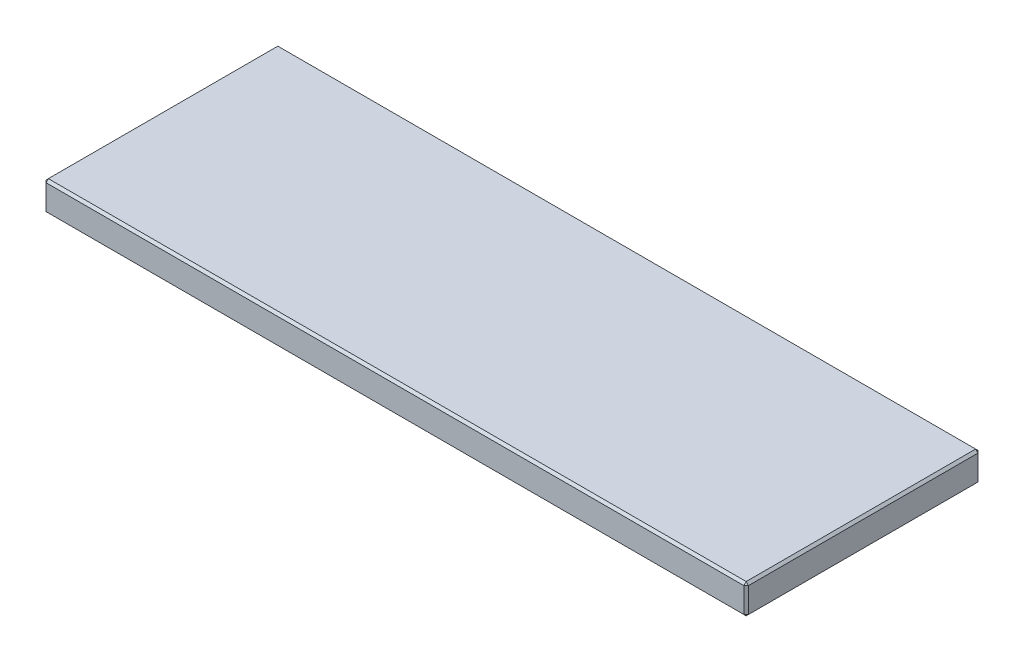
ISO-10303-21;
HEADER;
FILE_DESCRIPTION(('STEP AP214'),'2;1');
FILE_NAME('part.step','',(''),(''),'','','');
FILE_SCHEMA(('AUTOMOTIVE_DESIGN { 1 0 10303 214 1 1 1 1 }'));
ENDSEC;
DATA;
#1=APPLICATION_CONTEXT('core data for automotive mechanical design processes');
#2=APPLICATION_PROTOCOL_DEFINITION('international standard','automotive_design',2000,#1);
#3=PRODUCT_CONTEXT('',#1,'mechanical');
#4=PRODUCT('Part','Part','',(#3));
#5=PRODUCT_RELATED_PRODUCT_CATEGORY('part','',(#4));
#6=PRODUCT_DEFINITION_FORMATION('','',#4);
#7=PRODUCT_DEFINITION_CONTEXT('part definition',#1,'design');
#8=PRODUCT_DEFINITION('design','',#6,#7);
#9=PRODUCT_DEFINITION_SHAPE('','',#8);
#10=(LENGTH_UNIT() NAMED_UNIT(*) SI_UNIT(.MILLI.,.METRE.));
#11=(NAMED_UNIT(*) PLANE_ANGLE_UNIT() SI_UNIT($,.RADIAN.));
#12=(NAMED_UNIT(*) SI_UNIT($,.STERADIAN.) SOLID_ANGLE_UNIT());
#13=UNCERTAINTY_MEASURE_WITH_UNIT(LENGTH_MEASURE(1.E-05),#10,'distance_accuracy_value','');
#14=(GEOMETRIC_REPRESENTATION_CONTEXT(3) GLOBAL_UNCERTAINTY_ASSIGNED_CONTEXT((#13)) GLOBAL_UNIT_ASSIGNED_CONTEXT((#10,
#11,#12)) REPRESENTATION_CONTEXT('',''));
#15=CARTESIAN_POINT('',(0.,0.,0.));
#16=DIRECTION('',(0.,0.,1.));
#17=DIRECTION('',(1.,0.,0.));
#18=AXIS2_PLACEMENT_3D('',#15,#16,#17);
#19=CARTESIAN_POINT('',(37.5,3.175,12.5));
#20=DIRECTION('',(-1.,0.,0.));
#21=DIRECTION('',(0.,0.,1.));
#22=AXIS2_PLACEMENT_3D('',#19,#20,#21);
#23=PLANE('',#22);
#24=DIRECTION('',(0.,-1.,0.));
#25=VECTOR('',#24,1.);
#26=CARTESIAN_POINT('',(37.5,3.175,12.25));
#27=LINE('',#26,#25);
#28=CARTESIAN_POINT('',(37.5,2.925,12.25));
#29=VERTEX_POINT('',#28);
#30=CARTESIAN_POINT('',(37.5,0.25,12.25));
#31=VERTEX_POINT('',#30);
#32=EDGE_CURVE('E131',#29,#31,#27,.T.);
#33=ORIENTED_EDGE('',*,*,#32,.T.);
#34=DIRECTION('',(0.,0.,-1.));
#35=VECTOR('',#34,1.);
#36=CARTESIAN_POINT('',(37.5,0.25,-12.5));
#37=LINE('',#36,#35);
#38=CARTESIAN_POINT('',(37.5,0.25,-12.25));
#39=VERTEX_POINT('',#38);
#40=EDGE_CURVE('E167',#31,#39,#37,.T.);
#41=ORIENTED_EDGE('',*,*,#40,.T.);
#42=DIRECTION('',(0.,1.,0.));
#43=VECTOR('',#42,1.);
#44=CARTESIAN_POINT('',(37.5,3.175,-12.25));
#45=LINE('',#44,#43);
#46=CARTESIAN_POINT('',(37.5,2.925,-12.25));
#47=VERTEX_POINT('',#46);
#48=EDGE_CURVE('E134',#39,#47,#45,.T.);
#49=ORIENTED_EDGE('',*,*,#48,.T.);
#50=DIRECTION('',(0.,0.,1.));
#51=VECTOR('',#50,1.);
#52=CARTESIAN_POINT('',(37.5,2.925,12.5));
#53=LINE('',#52,#51);
#54=EDGE_CURVE('E127',#47,#29,#53,.T.);
#55=ORIENTED_EDGE('',*,*,#54,.T.);
#56=EDGE_LOOP('',(#33,#41,#49,#55));
#57=FACE_BOUND('',#56,.T.);
#58=ADVANCED_FACE('F39',(#57),#23,.F.);
#59=CARTESIAN_POINT('',(-37.5,3.175,-12.5));
#60=DIRECTION('',(0.,0.,1.));
#61=DIRECTION('',(1.,0.,0.));
#62=AXIS2_PLACEMENT_3D('',#59,#60,#61);
#63=PLANE('',#62);
#64=DIRECTION('',(1.,0.,0.));
#65=VECTOR('',#64,1.);
#66=CARTESIAN_POINT('',(-37.5,2.925,-12.5));
#67=LINE('',#66,#65);
#68=CARTESIAN_POINT('',(-37.25,2.925,-12.5));
#69=VERTEX_POINT('',#68);
#70=CARTESIAN_POINT('',(37.25,2.925,-12.5));
#71=VERTEX_POINT('',#70);
#72=EDGE_CURVE('E178',#69,#71,#67,.T.);
#73=ORIENTED_EDGE('',*,*,#72,.T.);
#74=DIRECTION('',(0.,-1.,0.));
#75=VECTOR('',#74,1.);
#76=CARTESIAN_POINT('',(37.25,3.175,-12.5));
#77=LINE('',#76,#75);
#78=CARTESIAN_POINT('',(37.25,0.25,-12.5));
#79=VERTEX_POINT('',#78);
#80=EDGE_CURVE('E184',#71,#79,#77,.T.);
#81=ORIENTED_EDGE('',*,*,#80,.T.);
#82=DIRECTION('',(-1.,0.,0.));
#83=VECTOR('',#82,1.);
#84=CARTESIAN_POINT('',(-37.5,0.25,-12.5));
#85=LINE('',#84,#83);
#86=CARTESIAN_POINT('',(-37.25,0.25,-12.5));
#87=VERTEX_POINT('',#86);
#88=EDGE_CURVE('E182',#79,#87,#85,.T.);
#89=ORIENTED_EDGE('',*,*,#88,.T.);
#90=DIRECTION('',(0.,1.,0.));
#91=VECTOR('',#90,1.);
#92=CARTESIAN_POINT('',(-37.25,3.175,-12.5));
#93=LINE('',#92,#91);
#94=EDGE_CURVE('E180',#87,#69,#93,.T.);
#95=ORIENTED_EDGE('',*,*,#94,.T.);
#96=EDGE_LOOP('',(#73,#81,#89,#95));
#97=FACE_BOUND('',#96,.T.);
#98=ADVANCED_FACE('F271',(#97),#63,.F.);
#99=CARTESIAN_POINT('',(-37.5,3.175,12.5));
#100=DIRECTION('',(1.,0.,0.));
#101=DIRECTION('',(0.,0.,-1.));
#102=AXIS2_PLACEMENT_3D('',#99,#100,#101);
#103=PLANE('',#102);
#104=DIRECTION('',(0.,0.,-1.));
#105=VECTOR('',#104,1.);
#106=CARTESIAN_POINT('',(-37.5,2.925,12.5));
#107=LINE('',#106,#105);
#108=CARTESIAN_POINT('',(-37.5,2.925,12.25));
#109=VERTEX_POINT('',#108);
#110=CARTESIAN_POINT('',(-37.5,2.925,-12.25));
#111=VERTEX_POINT('',#110);
#112=EDGE_CURVE('E189',#109,#111,#107,.T.);
#113=ORIENTED_EDGE('',*,*,#112,.T.);
#114=DIRECTION('',(0.,-1.,0.));
#115=VECTOR('',#114,1.);
#116=CARTESIAN_POINT('',(-37.5,3.175,-12.25));
#117=LINE('',#116,#115);
#118=CARTESIAN_POINT('',(-37.5,0.25,-12.25));
#119=VERTEX_POINT('',#118);
#120=EDGE_CURVE('E193',#111,#119,#117,.T.);
#121=ORIENTED_EDGE('',*,*,#120,.T.);
#122=DIRECTION('',(0.,0.,1.));
#123=VECTOR('',#122,1.);
#124=CARTESIAN_POINT('',(-37.5,0.25,12.5));
#125=LINE('',#124,#123);
#126=CARTESIAN_POINT('',(-37.5,0.25,12.25));
#127=VERTEX_POINT('',#126);
#128=EDGE_CURVE('E191',#119,#127,#125,.T.);
#129=ORIENTED_EDGE('',*,*,#128,.T.);
#130=DIRECTION('',(0.,1.,0.));
#131=VECTOR('',#130,1.);
#132=CARTESIAN_POINT('',(-37.5,3.175,12.25));
#133=LINE('',#132,#131);
#134=EDGE_CURVE('E187',#127,#109,#133,.T.);
#135=ORIENTED_EDGE('',*,*,#134,.T.);
#136=EDGE_LOOP('',(#113,#121,#129,#135));
#137=FACE_BOUND('',#136,.T.);
#138=ADVANCED_FACE('F280',(#137),#103,.F.);
#139=CARTESIAN_POINT('',(-37.5,3.175,12.5));
#140=DIRECTION('',(0.,0.,-1.));
#141=DIRECTION('',(-1.,0.,0.));
#142=AXIS2_PLACEMENT_3D('',#139,#140,#141);
#143=PLANE('',#142);
#144=DIRECTION('',(-1.,0.,0.));
#145=VECTOR('',#144,1.);
#146=CARTESIAN_POINT('',(-37.5,2.925,12.5));
#147=LINE('',#146,#145);
#148=CARTESIAN_POINT('',(37.25,2.925,12.5));
#149=VERTEX_POINT('',#148);
#150=CARTESIAN_POINT('',(-37.25,2.925,12.5));
#151=VERTEX_POINT('',#150);
#152=EDGE_CURVE('E49',#149,#151,#147,.T.);
#153=ORIENTED_EDGE('',*,*,#152,.T.);
#154=DIRECTION('',(0.,-1.,0.));
#155=VECTOR('',#154,1.);
#156=CARTESIAN_POINT('',(-37.25,3.175,12.5));
#157=LINE('',#156,#155);
#158=CARTESIAN_POINT('',(-37.25,0.25,12.5));
#159=VERTEX_POINT('',#158);
#160=EDGE_CURVE('E11',#151,#159,#157,.T.);
#161=ORIENTED_EDGE('',*,*,#160,.T.);
#162=DIRECTION('',(1.,0.,0.));
#163=VECTOR('',#162,1.);
#164=CARTESIAN_POINT('',(37.5,0.25,12.5));
#165=LINE('',#164,#163);
#166=CARTESIAN_POINT('',(37.25,0.25,12.5));
#167=VERTEX_POINT('',#166);
#168=EDGE_CURVE('E204',#159,#167,#165,.T.);
#169=ORIENTED_EDGE('',*,*,#168,.T.);
#170=DIRECTION('',(0.,1.,0.));
#171=VECTOR('',#170,1.);
#172=CARTESIAN_POINT('',(37.25,3.175,12.5));
#173=LINE('',#172,#171);
#174=EDGE_CURVE('E60',#167,#149,#173,.T.);
#175=ORIENTED_EDGE('',*,*,#174,.T.);
#176=EDGE_LOOP('',(#153,#161,#169,#175));
#177=FACE_BOUND('',#176,.T.);
#178=ADVANCED_FACE('F292',(#177),#143,.F.);
#179=CARTESIAN_POINT('',(0.,3.175,0.));
#180=DIRECTION('',(0.,-1.,0.));
#181=DIRECTION('',(0.,0.,-1.));
#182=AXIS2_PLACEMENT_3D('',#179,#180,#181);
#183=PLANE('',#182);
#184=DIRECTION('',(-1.,0.,0.));
#185=VECTOR('',#184,1.);
#186=CARTESIAN_POINT('',(0.,3.175,-12.25));
#187=LINE('',#186,#185);
#188=CARTESIAN_POINT('',(37.25,3.175,-12.25));
#189=VERTEX_POINT('',#188);
#190=CARTESIAN_POINT('',(-37.25,3.175,-12.25));
#191=VERTEX_POINT('',#190);
#192=EDGE_CURVE('E199',#189,#191,#187,.T.);
#193=ORIENTED_EDGE('',*,*,#192,.T.);
#194=DIRECTION('',(0.,0.,1.));
#195=VECTOR('',#194,1.);
#196=CARTESIAN_POINT('',(-37.25,3.175,0.));
#197=LINE('',#196,#195);
#198=CARTESIAN_POINT('',(-37.25,3.175,12.25));
#199=VERTEX_POINT('',#198);
#200=EDGE_CURVE('E201',#191,#199,#197,.T.);
#201=ORIENTED_EDGE('',*,*,#200,.T.);
#202=DIRECTION('',(1.,0.,0.));
#203=VECTOR('',#202,1.);
#204=CARTESIAN_POINT('',(0.,3.175,12.25));
#205=LINE('',#204,#203);
#206=CARTESIAN_POINT('',(37.25,3.175,12.25));
#207=VERTEX_POINT('',#206);
#208=EDGE_CURVE('E196',#199,#207,#205,.T.);
#209=ORIENTED_EDGE('',*,*,#208,.T.);
#210=DIRECTION('',(0.,0.,-1.));
#211=VECTOR('',#210,1.);
#212=CARTESIAN_POINT('',(37.25,3.175,0.));
#213=LINE('',#212,#211);
#214=EDGE_CURVE('E144',#207,#189,#213,.T.);
#215=ORIENTED_EDGE('',*,*,#214,.T.);
#216=EDGE_LOOP('',(#193,#201,#209,#215));
#217=FACE_BOUND('',#216,.T.);
#218=ADVANCED_FACE('F425',(#217),#183,.F.);
#219=CARTESIAN_POINT('',(0.,0.,0.));
#220=DIRECTION('',(0.,-1.,0.));
#221=DIRECTION('',(0.,0.,-1.));
#222=AXIS2_PLACEMENT_3D('',#219,#220,#221);
#223=PLANE('',#222);
#224=DIRECTION('',(1.,0.,0.));
#225=VECTOR('',#224,1.);
#226=CARTESIAN_POINT('',(37.5,0.,-12.25));
#227=LINE('',#226,#225);
#228=CARTESIAN_POINT('',(-37.25,0.,-12.25));
#229=VERTEX_POINT('',#228);
#230=CARTESIAN_POINT('',(37.25,0.,-12.25));
#231=VERTEX_POINT('',#230);
#232=EDGE_CURVE('E173',#229,#231,#227,.T.);
#233=ORIENTED_EDGE('',*,*,#232,.T.);
#234=DIRECTION('',(0.,0.,1.));
#235=VECTOR('',#234,1.);
#236=CARTESIAN_POINT('',(37.25,0.,12.5));
#237=LINE('',#236,#235);
#238=CARTESIAN_POINT('',(37.25,0.,12.25));
#239=VERTEX_POINT('',#238);
#240=EDGE_CURVE('E175',#231,#239,#237,.T.);
#241=ORIENTED_EDGE('',*,*,#240,.T.);
#242=DIRECTION('',(-1.,0.,0.));
#243=VECTOR('',#242,1.);
#244=CARTESIAN_POINT('',(-37.5,0.,12.25));
#245=LINE('',#244,#243);
#246=CARTESIAN_POINT('',(-37.25,0.,12.25));
#247=VERTEX_POINT('',#246);
#248=EDGE_CURVE('E169',#239,#247,#245,.T.);
#249=ORIENTED_EDGE('',*,*,#248,.T.);
#250=DIRECTION('',(0.,0.,-1.));
#251=VECTOR('',#250,1.);
#252=CARTESIAN_POINT('',(-37.25,0.,-12.5));
#253=LINE('',#252,#251);
#254=EDGE_CURVE('E171',#247,#229,#253,.T.);
#255=ORIENTED_EDGE('',*,*,#254,.T.);
#256=EDGE_LOOP('',(#233,#241,#249,#255));
#257=FACE_BOUND('',#256,.T.);
#258=ADVANCED_FACE('F421',(#257),#223,.T.);
#259=CARTESIAN_POINT('',(-37.25,3.175,0.));
#260=DIRECTION('',(0.707106781186547,-0.707106781186547,0.));
#261=DIRECTION('',(0.,0.,1.));
#262=AXIS2_PLACEMENT_3D('',#259,#260,#261);
#263=PLANE('',#262);
#264=DIRECTION('',(0.707106781186547,0.707106781186547,0.));
#265=VECTOR('',#264,1.);
#266=CARTESIAN_POINT('',(-37.25,3.175,12.25));
#267=LINE('',#266,#265);
#268=EDGE_CURVE('E44',#199,#109,#267,.F.);
#269=ORIENTED_EDGE('',*,*,#268,.F.);
#270=ORIENTED_EDGE('',*,*,#200,.F.);
#271=DIRECTION('',(-0.707106781186547,-0.707106781186547,0.));
#272=VECTOR('',#271,1.);
#273=CARTESIAN_POINT('',(-37.375,3.05,-12.25));
#274=LINE('',#273,#272);
#275=EDGE_CURVE('E164',#111,#191,#274,.F.);
#276=ORIENTED_EDGE('',*,*,#275,.F.);
#277=ORIENTED_EDGE('',*,*,#112,.F.);
#278=EDGE_LOOP('',(#269,#270,#276,#277));
#279=FACE_BOUND('',#278,.T.);
#280=ADVANCED_FACE('F42',(#279),#263,.F.);
#281=CARTESIAN_POINT('',(-37.25,3.175,12.25));
#282=DIRECTION('',(-0.577350269189626,0.577350269189626,0.577350269189626));
#283=DIRECTION('',(0.707106781186547,0.,0.707106781186547));
#284=AXIS2_PLACEMENT_3D('',#281,#282,#283);
#285=PLANE('',#284);
#286=DIRECTION('',(0.,-0.707106781186547,0.707106781186547));
#287=VECTOR('',#286,1.);
#288=CARTESIAN_POINT('',(-37.25,3.175,12.25));
#289=LINE('',#288,#287);
#290=EDGE_CURVE('E250',#199,#151,#289,.T.);
#291=ORIENTED_EDGE('',*,*,#290,.F.);
#292=ORIENTED_EDGE('',*,*,#268,.T.);
#293=DIRECTION('',(-0.707106781186547,0.,-0.707106781186547));
#294=VECTOR('',#293,1.);
#295=CARTESIAN_POINT('',(-37.375,2.925,12.375));
#296=LINE('',#295,#294);
#297=EDGE_CURVE('E252',#151,#109,#296,.T.);
#298=ORIENTED_EDGE('',*,*,#297,.F.);
#299=EDGE_LOOP('',(#291,#292,#298));
#300=FACE_BOUND('',#299,.T.);
#301=ADVANCED_FACE('F286',(#300),#285,.T.);
#302=CARTESIAN_POINT('',(-37.25,2.925,-12.5));
#303=DIRECTION('',(-0.577350269189626,0.577350269189626,-0.577350269189626));
#304=DIRECTION('',(-0.707106781186547,0.,0.707106781186547));
#305=AXIS2_PLACEMENT_3D('',#302,#303,#304);
#306=PLANE('',#305);
#307=DIRECTION('',(0.707106781186547,0.,-0.707106781186547));
#308=VECTOR('',#307,1.);
#309=CARTESIAN_POINT('',(-37.25,2.925,-12.5));
#310=LINE('',#309,#308);
#311=EDGE_CURVE('E244',#111,#69,#310,.T.);
#312=ORIENTED_EDGE('',*,*,#311,.F.);
#313=ORIENTED_EDGE('',*,*,#275,.T.);
#314=DIRECTION('',(0.,0.707106781186547,0.707106781186547));
#315=VECTOR('',#314,1.);
#316=CARTESIAN_POINT('',(-37.25,2.925,-12.5));
#317=LINE('',#316,#315);
#318=EDGE_CURVE('E247',#69,#191,#317,.T.);
#319=ORIENTED_EDGE('',*,*,#318,.F.);
#320=EDGE_LOOP('',(#312,#313,#319));
#321=FACE_BOUND('',#320,.T.);
#322=ADVANCED_FACE('F259',(#321),#306,.T.);
#323=CARTESIAN_POINT('',(-37.25,3.175,12.5));
#324=DIRECTION('',(0.707106781186547,0.,-0.707106781186547));
#325=DIRECTION('',(0.,-1.,0.));
#326=AXIS2_PLACEMENT_3D('',#323,#324,#325);
#327=PLANE('',#326);
#328=ORIENTED_EDGE('',*,*,#297,.T.);
#329=ORIENTED_EDGE('',*,*,#134,.F.);
#330=DIRECTION('',(0.707106781186547,0.,0.707106781186547));
#331=VECTOR('',#330,1.);
#332=CARTESIAN_POINT('',(-37.5,0.25,12.25));
#333=LINE('',#332,#331);
#334=EDGE_CURVE('E238',#159,#127,#333,.F.);
#335=ORIENTED_EDGE('',*,*,#334,.F.);
#336=ORIENTED_EDGE('',*,*,#160,.F.);
#337=EDGE_LOOP('',(#328,#329,#335,#336));
#338=FACE_BOUND('',#337,.T.);
#339=ADVANCED_FACE('F289',(#338),#327,.F.);
#340=CARTESIAN_POINT('',(0.,3.175,12.25));
#341=DIRECTION('',(0.,-0.707106781186547,-0.707106781186547));
#342=DIRECTION('',(1.,0.,0.));
#343=AXIS2_PLACEMENT_3D('',#340,#341,#342);
#344=PLANE('',#343);
#345=ORIENTED_EDGE('',*,*,#290,.T.);
#346=ORIENTED_EDGE('',*,*,#152,.F.);
#347=DIRECTION('',(0.,0.707106781186547,-0.707106781186547));
#348=VECTOR('',#347,1.);
#349=CARTESIAN_POINT('',(37.25,3.05,12.375));
#350=LINE('',#349,#348);
#351=EDGE_CURVE('E148',#207,#149,#350,.F.);
#352=ORIENTED_EDGE('',*,*,#351,.F.);
#353=ORIENTED_EDGE('',*,*,#208,.F.);
#354=EDGE_LOOP('',(#345,#346,#352,#353));
#355=FACE_BOUND('',#354,.T.);
#356=ADVANCED_FACE('F403',(#355),#344,.F.);
#357=CARTESIAN_POINT('',(37.25,3.175,0.));
#358=DIRECTION('',(-0.707106781186547,-0.707106781186547,0.));
#359=DIRECTION('',(0.,0.,-1.));
#360=AXIS2_PLACEMENT_3D('',#357,#358,#359);
#361=PLANE('',#360);
#362=DIRECTION('',(-0.707106781186547,0.707106781186547,0.));
#363=VECTOR('',#362,1.);
#364=CARTESIAN_POINT('',(37.5,2.925,-12.25));
#365=LINE('',#364,#363);
#366=EDGE_CURVE('E149',#189,#47,#365,.F.);
#367=ORIENTED_EDGE('',*,*,#366,.F.);
#368=ORIENTED_EDGE('',*,*,#214,.F.);
#369=DIRECTION('',(0.707106781186547,-0.707106781186547,0.));
#370=VECTOR('',#369,1.);
#371=CARTESIAN_POINT('',(37.5,2.925,12.25));
#372=LINE('',#371,#370);
#373=EDGE_CURVE('E141',#29,#207,#372,.F.);
#374=ORIENTED_EDGE('',*,*,#373,.F.);
#375=ORIENTED_EDGE('',*,*,#54,.F.);
#376=EDGE_LOOP('',(#367,#368,#374,#375));
#377=FACE_BOUND('',#376,.T.);
#378=ADVANCED_FACE('F143',(#377),#361,.F.);
#379=CARTESIAN_POINT('',(0.,3.175,-12.25));
#380=DIRECTION('',(0.,-0.707106781186547,0.707106781186547));
#381=DIRECTION('',(-1.,0.,0.));
#382=AXIS2_PLACEMENT_3D('',#379,#380,#381);
#383=PLANE('',#382);
#384=ORIENTED_EDGE('',*,*,#318,.T.);
#385=ORIENTED_EDGE('',*,*,#192,.F.);
#386=DIRECTION('',(0.,-0.707106781186547,-0.707106781186547));
#387=VECTOR('',#386,1.);
#388=CARTESIAN_POINT('',(37.25,3.05,-12.375));
#389=LINE('',#388,#387);
#390=EDGE_CURVE('E233',#71,#189,#389,.F.);
#391=ORIENTED_EDGE('',*,*,#390,.F.);
#392=ORIENTED_EDGE('',*,*,#72,.F.);
#393=EDGE_LOOP('',(#384,#385,#391,#392));
#394=FACE_BOUND('',#393,.T.);
#395=ADVANCED_FACE('F267',(#394),#383,.F.);
#396=CARTESIAN_POINT('',(-37.5,3.175,-12.25));
#397=DIRECTION('',(0.707106781186547,0.,0.707106781186547));
#398=DIRECTION('',(0.,-1.,0.));
#399=AXIS2_PLACEMENT_3D('',#396,#397,#398);
#400=PLANE('',#399);
#401=ORIENTED_EDGE('',*,*,#311,.T.);
#402=ORIENTED_EDGE('',*,*,#94,.F.);
#403=DIRECTION('',(-0.707106781186547,0.,0.707106781186547));
#404=VECTOR('',#403,1.);
#405=CARTESIAN_POINT('',(-37.25,0.25,-12.5));
#406=LINE('',#405,#404);
#407=EDGE_CURVE('E230',#119,#87,#406,.F.);
#408=ORIENTED_EDGE('',*,*,#407,.F.);
#409=ORIENTED_EDGE('',*,*,#120,.F.);
#410=EDGE_LOOP('',(#401,#402,#408,#409));
#411=FACE_BOUND('',#410,.T.);
#412=ADVANCED_FACE('F277',(#411),#400,.F.);
#413=CARTESIAN_POINT('',(-37.5,0.25,12.5));
#414=DIRECTION('',(-0.707106781186547,-0.707106781186547,0.));
#415=DIRECTION('',(0.,0.,-1.));
#416=AXIS2_PLACEMENT_3D('',#413,#414,#415);
#417=PLANE('',#416);
#418=DIRECTION('',(0.707106781186547,-0.707106781186547,0.));
#419=VECTOR('',#418,1.);
#420=CARTESIAN_POINT('',(-37.5,0.25,12.25));
#421=LINE('',#420,#419);
#422=EDGE_CURVE('E241',#127,#247,#421,.T.);
#423=ORIENTED_EDGE('',*,*,#422,.F.);
#424=ORIENTED_EDGE('',*,*,#128,.F.);
#425=DIRECTION('',(-0.707106781186547,0.707106781186547,0.));
#426=VECTOR('',#425,1.);
#427=CARTESIAN_POINT('',(-37.375,0.125,-12.25));
#428=LINE('',#427,#426);
#429=EDGE_CURVE('E228',#229,#119,#428,.T.);
#430=ORIENTED_EDGE('',*,*,#429,.F.);
#431=ORIENTED_EDGE('',*,*,#254,.F.);
#432=EDGE_LOOP('',(#423,#424,#430,#431));
#433=FACE_BOUND('',#432,.T.);
#434=ADVANCED_FACE('F386',(#433),#417,.T.);
#435=CARTESIAN_POINT('',(-37.5,0.25,12.25));
#436=DIRECTION('',(-0.577350269189626,-0.577350269189626,0.577350269189626));
#437=DIRECTION('',(0.707106781186547,0.,0.707106781186547));
#438=AXIS2_PLACEMENT_3D('',#435,#436,#437);
#439=PLANE('',#438);
#440=ORIENTED_EDGE('',*,*,#334,.T.);
#441=ORIENTED_EDGE('',*,*,#422,.T.);
#442=DIRECTION('',(0.,0.707106781186547,0.707106781186547));
#443=VECTOR('',#442,1.);
#444=CARTESIAN_POINT('',(-37.25,0.125,12.375));
#445=LINE('',#444,#443);
#446=EDGE_CURVE('E155',#159,#247,#445,.F.);
#447=ORIENTED_EDGE('',*,*,#446,.F.);
#448=EDGE_LOOP('',(#440,#441,#447));
#449=FACE_BOUND('',#448,.T.);
#450=ADVANCED_FACE('F322',(#449),#439,.T.);
#451=CARTESIAN_POINT('',(37.5,2.925,12.25));
#452=DIRECTION('',(0.577350269189626,0.577350269189626,0.577350269189626));
#453=DIRECTION('',(0.707106781186547,0.,-0.707106781186547));
#454=AXIS2_PLACEMENT_3D('',#451,#452,#453);
#455=PLANE('',#454);
#456=ORIENTED_EDGE('',*,*,#373,.T.);
#457=ORIENTED_EDGE('',*,*,#351,.T.);
#458=DIRECTION('',(-0.707106781186547,0.,0.707106781186547));
#459=VECTOR('',#458,1.);
#460=CARTESIAN_POINT('',(37.5,2.925,12.25));
#461=LINE('',#460,#459);
#462=EDGE_CURVE('E152',#29,#149,#461,.T.);
#463=ORIENTED_EDGE('',*,*,#462,.F.);
#464=EDGE_LOOP('',(#456,#457,#463));
#465=FACE_BOUND('',#464,.T.);
#466=ADVANCED_FACE('F153',(#465),#455,.T.);
#467=CARTESIAN_POINT('',(37.5,2.925,-12.25));
#468=DIRECTION('',(0.577350269189626,0.577350269189626,-0.577350269189626));
#469=DIRECTION('',(-0.707106781186547,0.,-0.707106781186547));
#470=AXIS2_PLACEMENT_3D('',#467,#468,#469);
#471=PLANE('',#470);
#472=ORIENTED_EDGE('',*,*,#390,.T.);
#473=ORIENTED_EDGE('',*,*,#366,.T.);
#474=DIRECTION('',(0.707106781186547,0.,0.707106781186547));
#475=VECTOR('',#474,1.);
#476=CARTESIAN_POINT('',(37.5,2.925,-12.25));
#477=LINE('',#476,#475);
#478=EDGE_CURVE('E156',#71,#47,#477,.T.);
#479=ORIENTED_EDGE('',*,*,#478,.F.);
#480=EDGE_LOOP('',(#472,#473,#479));
#481=FACE_BOUND('',#480,.T.);
#482=ADVANCED_FACE('F312',(#481),#471,.T.);
#483=CARTESIAN_POINT('',(-37.25,0.25,-12.5));
#484=DIRECTION('',(-0.577350269189626,-0.577350269189626,-0.577350269189626));
#485=DIRECTION('',(-0.707106781186547,0.,0.707106781186547));
#486=AXIS2_PLACEMENT_3D('',#483,#484,#485);
#487=PLANE('',#486);
#488=ORIENTED_EDGE('',*,*,#429,.T.);
#489=ORIENTED_EDGE('',*,*,#407,.T.);
#490=DIRECTION('',(0.,-0.707106781186547,0.707106781186547));
#491=VECTOR('',#490,1.);
#492=CARTESIAN_POINT('',(-37.25,0.25,-12.5));
#493=LINE('',#492,#491);
#494=EDGE_CURVE('E221',#229,#87,#493,.F.);
#495=ORIENTED_EDGE('',*,*,#494,.F.);
#496=EDGE_LOOP('',(#488,#489,#495));
#497=FACE_BOUND('',#496,.T.);
#498=ADVANCED_FACE('F314',(#497),#487,.T.);
#499=CARTESIAN_POINT('',(-37.5,0.25,12.5));
#500=DIRECTION('',(0.,-0.707106781186547,0.707106781186547));
#501=DIRECTION('',(-1.,0.,0.));
#502=AXIS2_PLACEMENT_3D('',#499,#500,#501);
#503=PLANE('',#502);
#504=ORIENTED_EDGE('',*,*,#446,.T.);
#505=ORIENTED_EDGE('',*,*,#248,.F.);
#506=DIRECTION('',(0.,-0.707106781186547,-0.707106781186547));
#507=VECTOR('',#506,1.);
#508=CARTESIAN_POINT('',(37.25,0.,12.25));
#509=LINE('',#508,#507);
#510=EDGE_CURVE('E218',#167,#239,#509,.T.);
#511=ORIENTED_EDGE('',*,*,#510,.F.);
#512=ORIENTED_EDGE('',*,*,#168,.F.);
#513=EDGE_LOOP('',(#504,#505,#511,#512));
#514=FACE_BOUND('',#513,.T.);
#515=ADVANCED_FACE('F297',(#514),#503,.T.);
#516=CARTESIAN_POINT('',(37.5,3.175,12.25));
#517=DIRECTION('',(-0.707106781186547,0.,-0.707106781186547));
#518=DIRECTION('',(0.,-1.,0.));
#519=AXIS2_PLACEMENT_3D('',#516,#517,#518);
#520=PLANE('',#519);
#521=ORIENTED_EDGE('',*,*,#462,.T.);
#522=ORIENTED_EDGE('',*,*,#174,.F.);
#523=DIRECTION('',(0.707106781186547,0.,-0.707106781186547));
#524=VECTOR('',#523,1.);
#525=CARTESIAN_POINT('',(37.375,0.25,12.375));
#526=LINE('',#525,#524);
#527=EDGE_CURVE('E160',#31,#167,#526,.F.);
#528=ORIENTED_EDGE('',*,*,#527,.F.);
#529=ORIENTED_EDGE('',*,*,#32,.F.);
#530=EDGE_LOOP('',(#521,#522,#528,#529));
#531=FACE_BOUND('',#530,.T.);
#532=ADVANCED_FACE('F158',(#531),#520,.F.);
#533=CARTESIAN_POINT('',(37.25,3.175,-12.5));
#534=DIRECTION('',(-0.707106781186547,0.,0.707106781186547));
#535=DIRECTION('',(0.,-1.,0.));
#536=AXIS2_PLACEMENT_3D('',#533,#534,#535);
#537=PLANE('',#536);
#538=ORIENTED_EDGE('',*,*,#478,.T.);
#539=ORIENTED_EDGE('',*,*,#48,.F.);
#540=DIRECTION('',(-0.707106781186547,0.,-0.707106781186547));
#541=VECTOR('',#540,1.);
#542=CARTESIAN_POINT('',(37.5,0.25,-12.25));
#543=LINE('',#542,#541);
#544=EDGE_CURVE('E214',#79,#39,#543,.F.);
#545=ORIENTED_EDGE('',*,*,#544,.F.);
#546=ORIENTED_EDGE('',*,*,#80,.F.);
#547=EDGE_LOOP('',(#538,#539,#545,#546));
#548=FACE_BOUND('',#547,.T.);
#549=ADVANCED_FACE('F310',(#548),#537,.F.);
#550=CARTESIAN_POINT('',(-37.5,0.25,-12.5));
#551=DIRECTION('',(0.,-0.707106781186547,-0.707106781186547));
#552=DIRECTION('',(1.,0.,0.));
#553=AXIS2_PLACEMENT_3D('',#550,#551,#552);
#554=PLANE('',#553);
#555=ORIENTED_EDGE('',*,*,#494,.T.);
#556=ORIENTED_EDGE('',*,*,#88,.F.);
#557=DIRECTION('',(0.,0.707106781186547,-0.707106781186547));
#558=VECTOR('',#557,1.);
#559=CARTESIAN_POINT('',(37.25,0.125,-12.375));
#560=LINE('',#559,#558);
#561=EDGE_CURVE('E212',#231,#79,#560,.T.);
#562=ORIENTED_EDGE('',*,*,#561,.F.);
#563=ORIENTED_EDGE('',*,*,#232,.F.);
#564=EDGE_LOOP('',(#555,#556,#562,#563));
#565=FACE_BOUND('',#564,.T.);
#566=ADVANCED_FACE('F349',(#565),#554,.T.);
#567=CARTESIAN_POINT('',(37.25,0.,12.25));
#568=DIRECTION('',(0.577350269189626,-0.577350269189626,0.577350269189626));
#569=DIRECTION('',(0.707106781186547,0.,-0.707106781186547));
#570=AXIS2_PLACEMENT_3D('',#567,#568,#569);
#571=PLANE('',#570);
#572=ORIENTED_EDGE('',*,*,#527,.T.);
#573=ORIENTED_EDGE('',*,*,#510,.T.);
#574=DIRECTION('',(0.707106781186547,0.707106781186547,0.));
#575=VECTOR('',#574,1.);
#576=CARTESIAN_POINT('',(37.25,0.,12.25));
#577=LINE('',#576,#575);
#578=EDGE_CURVE('E210',#31,#239,#577,.F.);
#579=ORIENTED_EDGE('',*,*,#578,.F.);
#580=EDGE_LOOP('',(#572,#573,#579));
#581=FACE_BOUND('',#580,.T.);
#582=ADVANCED_FACE('F299',(#581),#571,.T.);
#583=CARTESIAN_POINT('',(37.5,0.25,-12.25));
#584=DIRECTION('',(0.577350269189626,-0.577350269189626,-0.577350269189626));
#585=DIRECTION('',(-0.707106781186547,0.,-0.707106781186547));
#586=AXIS2_PLACEMENT_3D('',#583,#584,#585);
#587=PLANE('',#586);
#588=ORIENTED_EDGE('',*,*,#561,.T.);
#589=ORIENTED_EDGE('',*,*,#544,.T.);
#590=DIRECTION('',(-0.707106781186547,-0.707106781186547,0.));
#591=VECTOR('',#590,1.);
#592=CARTESIAN_POINT('',(37.5,0.25,-12.25));
#593=LINE('',#592,#591);
#594=EDGE_CURVE('E208',#231,#39,#593,.F.);
#595=ORIENTED_EDGE('',*,*,#594,.F.);
#596=EDGE_LOOP('',(#588,#589,#595));
#597=FACE_BOUND('',#596,.T.);
#598=ADVANCED_FACE('F307',(#597),#587,.T.);
#599=CARTESIAN_POINT('',(37.5,0.25,12.5));
#600=DIRECTION('',(0.707106781186547,-0.707106781186547,0.));
#601=DIRECTION('',(0.,0.,1.));
#602=AXIS2_PLACEMENT_3D('',#599,#600,#601);
#603=PLANE('',#602);
#604=ORIENTED_EDGE('',*,*,#578,.T.);
#605=ORIENTED_EDGE('',*,*,#240,.F.);
#606=ORIENTED_EDGE('',*,*,#594,.T.);
#607=ORIENTED_EDGE('',*,*,#40,.F.);
#608=EDGE_LOOP('',(#604,#605,#606,#607));
#609=FACE_BOUND('',#608,.T.);
#610=ADVANCED_FACE('F303',(#609),#603,.T.);
#611=CLOSED_SHELL('',(#58,#98,#138,#178,#218,#258,#280,#301,#322,#339,#356,#378,#395,#412,#434,
#450,#466,#482,#498,#515,#532,#549,#566,#582,#598,#610));
#612=MANIFOLD_SOLID_BREP('B2',#611);
#613=ADVANCED_BREP_SHAPE_REPRESENTATION('',(#18,#612),#14);
#614=SHAPE_DEFINITION_REPRESENTATION(#9,#613);
ENDSEC;
END-ISO-10303-21;
